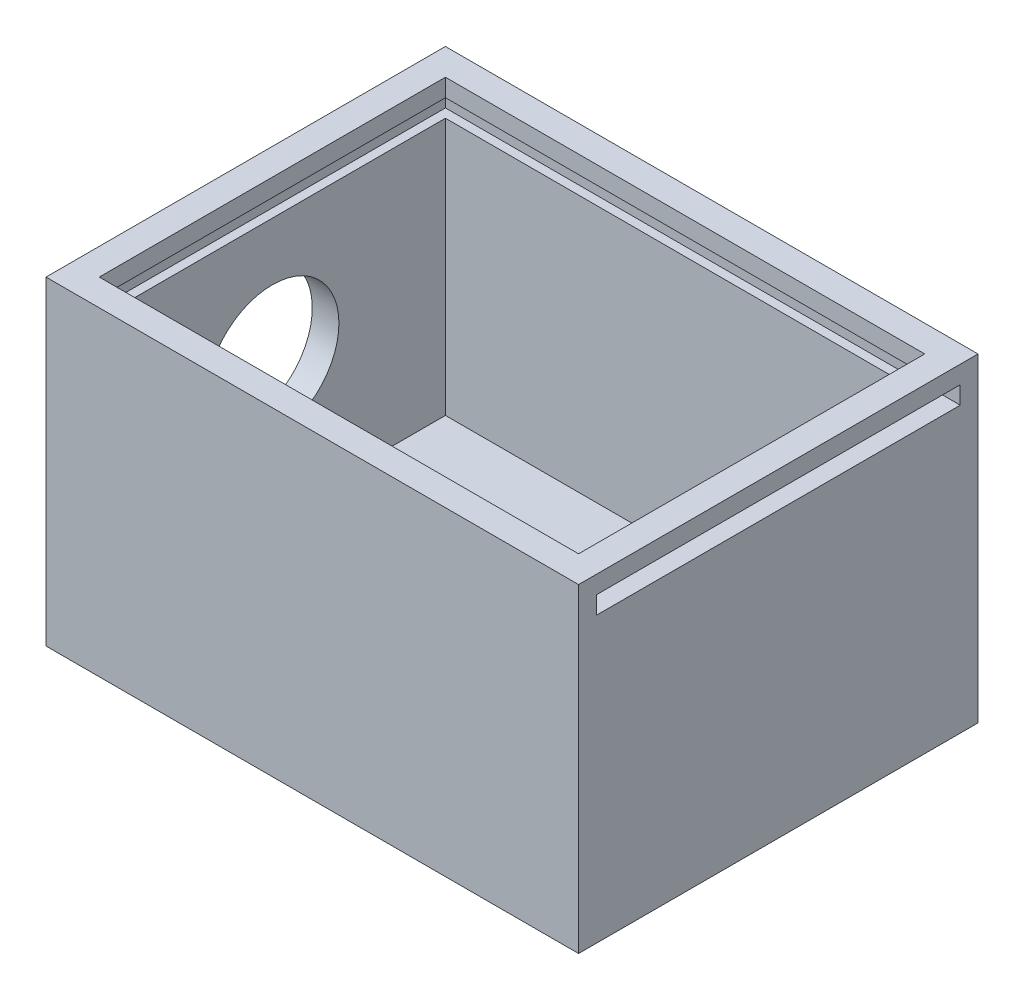
ISO-10303-21;
HEADER;
FILE_DESCRIPTION(('STEP AP214'),'2;1');
FILE_NAME('part.step','',(''),(''),'','','');
FILE_SCHEMA(('AUTOMOTIVE_DESIGN { 1 0 10303 214 1 1 1 1 }'));
ENDSEC;
DATA;
#1=APPLICATION_CONTEXT('core data for automotive mechanical design processes');
#2=APPLICATION_PROTOCOL_DEFINITION('international standard','automotive_design',2000,#1);
#3=PRODUCT_CONTEXT('',#1,'mechanical');
#4=PRODUCT('Part','Part','',(#3));
#5=PRODUCT_RELATED_PRODUCT_CATEGORY('part','',(#4));
#6=PRODUCT_DEFINITION_FORMATION('','',#4);
#7=PRODUCT_DEFINITION_CONTEXT('part definition',#1,'design');
#8=PRODUCT_DEFINITION('design','',#6,#7);
#9=PRODUCT_DEFINITION_SHAPE('','',#8);
#10=(LENGTH_UNIT() NAMED_UNIT(*) SI_UNIT(.MILLI.,.METRE.));
#11=(NAMED_UNIT(*) PLANE_ANGLE_UNIT() SI_UNIT($,.RADIAN.));
#12=(NAMED_UNIT(*) SI_UNIT($,.STERADIAN.) SOLID_ANGLE_UNIT());
#13=UNCERTAINTY_MEASURE_WITH_UNIT(LENGTH_MEASURE(1.E-05),#10,'distance_accuracy_value','');
#14=(GEOMETRIC_REPRESENTATION_CONTEXT(3) GLOBAL_UNCERTAINTY_ASSIGNED_CONTEXT((#13)) GLOBAL_UNIT_ASSIGNED_CONTEXT((#10,
#11,#12)) REPRESENTATION_CONTEXT('',''));
#15=CARTESIAN_POINT('',(0.,0.,0.));
#16=DIRECTION('',(0.,0.,1.));
#17=DIRECTION('',(1.,0.,0.));
#18=AXIS2_PLACEMENT_3D('',#15,#16,#17);
#19=CARTESIAN_POINT('',(3.,0.,45.));
#20=DIRECTION('',(1.,0.,0.));
#21=DIRECTION('',(0.,1.,0.));
#22=AXIS2_PLACEMENT_3D('',#19,#20,#21);
#23=PLANE('',#22);
#24=DIRECTION('',(0.,0.,1.));
#25=VECTOR('',#24,1.);
#26=CARTESIAN_POINT('',(3.,-2.00000000000001,45.));
#27=LINE('',#26,#25);
#28=CARTESIAN_POINT('',(3.,-2.00000000000001,3.));
#29=VERTEX_POINT('',#28);
#30=CARTESIAN_POINT('',(3.,-2.00000000000001,42.));
#31=VERTEX_POINT('',#30);
#32=EDGE_CURVE('E224',#29,#31,#27,.T.);
#33=ORIENTED_EDGE('',*,*,#32,.F.);
#34=DIRECTION('',(0.,-1.,0.));
#35=VECTOR('',#34,1.);
#36=CARTESIAN_POINT('',(3.,0.,3.));
#37=LINE('',#36,#35);
#38=CARTESIAN_POINT('',(3.,0.,3.));
#39=VERTEX_POINT('',#38);
#40=EDGE_CURVE('E232',#39,#29,#37,.T.);
#41=ORIENTED_EDGE('',*,*,#40,.F.);
#42=DIRECTION('',(0.,0.,-1.));
#43=VECTOR('',#42,1.);
#44=CARTESIAN_POINT('',(3.,0.,45.));
#45=LINE('',#44,#43);
#46=CARTESIAN_POINT('',(3.,0.,42.));
#47=VERTEX_POINT('',#46);
#48=EDGE_CURVE('E269',#47,#39,#45,.T.);
#49=ORIENTED_EDGE('',*,*,#48,.F.);
#50=DIRECTION('',(0.,-1.,0.));
#51=VECTOR('',#50,1.);
#52=CARTESIAN_POINT('',(3.,0.,42.));
#53=LINE('',#52,#51);
#54=EDGE_CURVE('E243',#47,#31,#53,.T.);
#55=ORIENTED_EDGE('',*,*,#54,.T.);
#56=EDGE_LOOP('',(#33,#41,#49,#55));
#57=FACE_BOUND('',#56,.T.);
#58=ADVANCED_FACE('F45',(#57),#23,.T.);
#59=CARTESIAN_POINT('',(57.,0.,45.));
#60=DIRECTION('',(-1.,0.,0.));
#61=DIRECTION('',(0.,-1.,0.));
#62=AXIS2_PLACEMENT_3D('',#59,#60,#61);
#63=PLANE('',#62);
#64=DIRECTION('',(0.,0.,-1.));
#65=VECTOR('',#64,1.);
#66=CARTESIAN_POINT('',(57.,-2.,45.));
#67=LINE('',#66,#65);
#68=CARTESIAN_POINT('',(57.,-2.,42.));
#69=VERTEX_POINT('',#68);
#70=CARTESIAN_POINT('',(57.,-2.00000000000001,3.));
#71=VERTEX_POINT('',#70);
#72=EDGE_CURVE('E69',#69,#71,#67,.T.);
#73=ORIENTED_EDGE('',*,*,#72,.F.);
#74=DIRECTION('',(0.,1.,0.));
#75=VECTOR('',#74,1.);
#76=CARTESIAN_POINT('',(57.,0.,42.));
#77=LINE('',#76,#75);
#78=CARTESIAN_POINT('',(57.,0.,42.));
#79=VERTEX_POINT('',#78);
#80=EDGE_CURVE('E258',#69,#79,#77,.T.);
#81=ORIENTED_EDGE('',*,*,#80,.T.);
#82=DIRECTION('',(0.,0.,-1.));
#83=VECTOR('',#82,1.);
#84=CARTESIAN_POINT('',(57.,0.,45.));
#85=LINE('',#84,#83);
#86=CARTESIAN_POINT('',(57.,0.,3.));
#87=VERTEX_POINT('',#86);
#88=EDGE_CURVE('E255',#79,#87,#85,.T.);
#89=ORIENTED_EDGE('',*,*,#88,.T.);
#90=DIRECTION('',(0.,1.,0.));
#91=VECTOR('',#90,1.);
#92=CARTESIAN_POINT('',(57.,0.,3.));
#93=LINE('',#92,#91);
#94=EDGE_CURVE('E251',#71,#87,#93,.T.);
#95=ORIENTED_EDGE('',*,*,#94,.F.);
#96=EDGE_LOOP('',(#73,#81,#89,#95));
#97=FACE_BOUND('',#96,.T.);
#98=ADVANCED_FACE('F351',(#97),#63,.T.);
#99=CARTESIAN_POINT('',(0.,0.,42.));
#100=DIRECTION('',(0.,0.,1.));
#101=DIRECTION('',(1.,0.,0.));
#102=AXIS2_PLACEMENT_3D('',#99,#100,#101);
#103=PLANE('',#102);
#104=ORIENTED_EDGE('',*,*,#80,.F.);
#105=DIRECTION('',(-1.,0.,0.));
#106=VECTOR('',#105,1.);
#107=CARTESIAN_POINT('',(0.,-2.00000000000001,42.));
#108=LINE('',#107,#106);
#109=EDGE_CURVE('E227',#69,#31,#108,.T.);
#110=ORIENTED_EDGE('',*,*,#109,.T.);
#111=ORIENTED_EDGE('',*,*,#54,.F.);
#112=DIRECTION('',(-1.,0.,0.));
#113=VECTOR('',#112,1.);
#114=CARTESIAN_POINT('',(0.,0.,42.));
#115=LINE('',#114,#113);
#116=EDGE_CURVE('E268',#79,#47,#115,.T.);
#117=ORIENTED_EDGE('',*,*,#116,.F.);
#118=EDGE_LOOP('',(#104,#110,#111,#117));
#119=FACE_BOUND('',#118,.T.);
#120=ADVANCED_FACE('F357',(#119),#103,.F.);
#121=CARTESIAN_POINT('',(0.,0.,3.));
#122=DIRECTION('',(0.,0.,1.));
#123=DIRECTION('',(1.,0.,0.));
#124=AXIS2_PLACEMENT_3D('',#121,#122,#123);
#125=PLANE('',#124);
#126=DIRECTION('',(-1.,0.,0.));
#127=VECTOR('',#126,1.);
#128=CARTESIAN_POINT('',(0.,-2.00000000000001,3.));
#129=LINE('',#128,#127);
#130=EDGE_CURVE('E11',#71,#29,#129,.T.);
#131=ORIENTED_EDGE('',*,*,#130,.F.);
#132=ORIENTED_EDGE('',*,*,#94,.T.);
#133=DIRECTION('',(-1.,0.,0.));
#134=VECTOR('',#133,1.);
#135=CARTESIAN_POINT('',(0.,0.,3.));
#136=LINE('',#135,#134);
#137=EDGE_CURVE('E263',#87,#39,#136,.T.);
#138=ORIENTED_EDGE('',*,*,#137,.T.);
#139=ORIENTED_EDGE('',*,*,#40,.T.);
#140=EDGE_LOOP('',(#131,#132,#138,#139));
#141=FACE_BOUND('',#140,.T.);
#142=ADVANCED_FACE('F362',(#141),#125,.T.);
#143=CARTESIAN_POINT('',(0.,0.,45.));
#144=DIRECTION('',(0.,-1.,0.));
#145=DIRECTION('',(0.,0.,-1.));
#146=AXIS2_PLACEMENT_3D('',#143,#144,#145);
#147=PLANE('',#146);
#148=DIRECTION('',(-1.,0.,0.));
#149=VECTOR('',#148,1.);
#150=CARTESIAN_POINT('',(0.,0.,0.));
#151=LINE('',#150,#149);
#152=CARTESIAN_POINT('',(60.,0.,0.));
#153=VERTEX_POINT('',#152);
#154=CARTESIAN_POINT('',(0.,0.,0.));
#155=VERTEX_POINT('',#154);
#156=EDGE_CURVE('E286',#153,#155,#151,.T.);
#157=ORIENTED_EDGE('',*,*,#156,.T.);
#158=DIRECTION('',(0.,0.,-1.));
#159=VECTOR('',#158,1.);
#160=CARTESIAN_POINT('',(0.,0.,45.));
#161=LINE('',#160,#159);
#162=CARTESIAN_POINT('',(0.,0.,45.));
#163=VERTEX_POINT('',#162);
#164=EDGE_CURVE('E295',#163,#155,#161,.T.);
#165=ORIENTED_EDGE('',*,*,#164,.F.);
#166=DIRECTION('',(-1.,0.,0.));
#167=VECTOR('',#166,1.);
#168=CARTESIAN_POINT('',(0.,0.,45.));
#169=LINE('',#168,#167);
#170=CARTESIAN_POINT('',(60.,0.,45.));
#171=VERTEX_POINT('',#170);
#172=EDGE_CURVE('E292',#171,#163,#169,.T.);
#173=ORIENTED_EDGE('',*,*,#172,.F.);
#174=DIRECTION('',(0.,0.,-1.));
#175=VECTOR('',#174,1.);
#176=CARTESIAN_POINT('',(60.,0.,45.));
#177=LINE('',#176,#175);
#178=EDGE_CURVE('E310',#171,#153,#177,.T.);
#179=ORIENTED_EDGE('',*,*,#178,.T.);
#180=EDGE_LOOP('',(#157,#165,#173,#179));
#181=FACE_BOUND('',#180,.T.);
#182=ORIENTED_EDGE('',*,*,#137,.F.);
#183=ORIENTED_EDGE('',*,*,#88,.F.);
#184=ORIENTED_EDGE('',*,*,#116,.T.);
#185=ORIENTED_EDGE('',*,*,#48,.T.);
#186=EDGE_LOOP('',(#182,#183,#184,#185));
#187=FACE_BOUND('',#186,.T.);
#188=ADVANCED_FACE('F359',(#181,#187),#147,.F.);
#189=CARTESIAN_POINT('',(0.,0.,45.));
#190=DIRECTION('',(1.,0.,0.));
#191=DIRECTION('',(0.,1.,0.));
#192=AXIS2_PLACEMENT_3D('',#189,#190,#191);
#193=PLANE('',#192);
#194=CARTESIAN_POINT('',(0.,-18.,22.5));
#195=DIRECTION('',(-1.,0.,0.));
#196=DIRECTION('',(0.,-1.,0.));
#197=AXIS2_PLACEMENT_3D('',#194,#195,#196);
#198=CIRCLE('',#197,7.5);
#199=CARTESIAN_POINT('',(0.,-25.5,22.5));
#200=VERTEX_POINT('',#199);
#201=EDGE_CURVE('E190',#200,#200,#198,.T.);
#202=ORIENTED_EDGE('',*,*,#201,.F.);
#203=EDGE_LOOP('',(#202));
#204=FACE_BOUND('',#203,.T.);
#205=DIRECTION('',(0.,-1.,0.));
#206=VECTOR('',#205,1.);
#207=CARTESIAN_POINT('',(0.,0.,0.));
#208=LINE('',#207,#206);
#209=CARTESIAN_POINT('',(0.,-36.,0.));
#210=VERTEX_POINT('',#209);
#211=EDGE_CURVE('E241',#155,#210,#208,.T.);
#212=ORIENTED_EDGE('',*,*,#211,.T.);
#213=DIRECTION('',(0.,0.,-1.));
#214=VECTOR('',#213,1.);
#215=CARTESIAN_POINT('',(0.,-36.,45.));
#216=LINE('',#215,#214);
#217=CARTESIAN_POINT('',(0.,-36.,45.));
#218=VERTEX_POINT('',#217);
#219=EDGE_CURVE('E318',#218,#210,#216,.T.);
#220=ORIENTED_EDGE('',*,*,#219,.F.);
#221=DIRECTION('',(0.,-1.,0.));
#222=VECTOR('',#221,1.);
#223=CARTESIAN_POINT('',(0.,0.,45.));
#224=LINE('',#223,#222);
#225=EDGE_CURVE('E281',#163,#218,#224,.T.);
#226=ORIENTED_EDGE('',*,*,#225,.F.);
#227=ORIENTED_EDGE('',*,*,#164,.T.);
#228=EDGE_LOOP('',(#212,#220,#226,#227));
#229=FACE_BOUND('',#228,.T.);
#230=ADVANCED_FACE('F47',(#204,#229),#193,.F.);
#231=CARTESIAN_POINT('',(0.,-36.,45.));
#232=DIRECTION('',(0.,1.,0.));
#233=DIRECTION('',(0.,0.,1.));
#234=AXIS2_PLACEMENT_3D('',#231,#232,#233);
#235=PLANE('',#234);
#236=DIRECTION('',(1.,0.,0.));
#237=VECTOR('',#236,1.);
#238=CARTESIAN_POINT('',(0.,-36.,0.));
#239=LINE('',#238,#237);
#240=CARTESIAN_POINT('',(60.,-36.,0.));
#241=VERTEX_POINT('',#240);
#242=EDGE_CURVE('E299',#210,#241,#239,.T.);
#243=ORIENTED_EDGE('',*,*,#242,.T.);
#244=DIRECTION('',(0.,0.,-1.));
#245=VECTOR('',#244,1.);
#246=CARTESIAN_POINT('',(60.,-36.,45.));
#247=LINE('',#246,#245);
#248=CARTESIAN_POINT('',(60.,-36.,45.));
#249=VERTEX_POINT('',#248);
#250=EDGE_CURVE('E314',#249,#241,#247,.T.);
#251=ORIENTED_EDGE('',*,*,#250,.F.);
#252=DIRECTION('',(1.,0.,0.));
#253=VECTOR('',#252,1.);
#254=CARTESIAN_POINT('',(0.,-36.,45.));
#255=LINE('',#254,#253);
#256=EDGE_CURVE('E285',#218,#249,#255,.T.);
#257=ORIENTED_EDGE('',*,*,#256,.F.);
#258=ORIENTED_EDGE('',*,*,#219,.T.);
#259=EDGE_LOOP('',(#243,#251,#257,#258));
#260=FACE_BOUND('',#259,.T.);
#261=ADVANCED_FACE('F409',(#260),#235,.F.);
#262=CARTESIAN_POINT('',(60.,0.,45.));
#263=DIRECTION('',(-1.,0.,0.));
#264=DIRECTION('',(0.,-1.,0.));
#265=AXIS2_PLACEMENT_3D('',#262,#263,#264);
#266=PLANE('',#265);
#267=DIRECTION('',(0.,0.,-1.));
#268=VECTOR('',#267,1.);
#269=CARTESIAN_POINT('',(60.,-3.99999999999999,43.));
#270=LINE('',#269,#268);
#271=CARTESIAN_POINT('',(60.,-3.99999999999999,43.));
#272=VERTEX_POINT('',#271);
#273=CARTESIAN_POINT('',(60.,-3.99999999999999,1.99999999999999));
#274=VERTEX_POINT('',#273);
#275=EDGE_CURVE('E198',#272,#274,#270,.T.);
#276=ORIENTED_EDGE('',*,*,#275,.F.);
#277=DIRECTION('',(0.,-1.,0.));
#278=VECTOR('',#277,1.);
#279=CARTESIAN_POINT('',(60.,-2.,43.));
#280=LINE('',#279,#278);
#281=CARTESIAN_POINT('',(60.,-2.,43.));
#282=VERTEX_POINT('',#281);
#283=EDGE_CURVE('E62',#282,#272,#280,.T.);
#284=ORIENTED_EDGE('',*,*,#283,.F.);
#285=DIRECTION('',(0.,0.,1.));
#286=VECTOR('',#285,1.);
#287=CARTESIAN_POINT('',(60.,-2.,43.));
#288=LINE('',#287,#286);
#289=CARTESIAN_POINT('',(60.,-2.,1.99999999999999));
#290=VERTEX_POINT('',#289);
#291=EDGE_CURVE('E183',#290,#282,#288,.T.);
#292=ORIENTED_EDGE('',*,*,#291,.F.);
#293=DIRECTION('',(0.,1.,0.));
#294=VECTOR('',#293,1.);
#295=CARTESIAN_POINT('',(60.,-2.,1.99999999999999));
#296=LINE('',#295,#294);
#297=EDGE_CURVE('E187',#274,#290,#296,.T.);
#298=ORIENTED_EDGE('',*,*,#297,.F.);
#299=EDGE_LOOP('',(#276,#284,#292,#298));
#300=FACE_BOUND('',#299,.T.);
#301=DIRECTION('',(0.,1.,0.));
#302=VECTOR('',#301,1.);
#303=CARTESIAN_POINT('',(60.,0.,0.));
#304=LINE('',#303,#302);
#305=EDGE_CURVE('E302',#241,#153,#304,.T.);
#306=ORIENTED_EDGE('',*,*,#305,.T.);
#307=ORIENTED_EDGE('',*,*,#178,.F.);
#308=DIRECTION('',(0.,1.,0.));
#309=VECTOR('',#308,1.);
#310=CARTESIAN_POINT('',(60.,0.,45.));
#311=LINE('',#310,#309);
#312=EDGE_CURVE('E289',#249,#171,#311,.T.);
#313=ORIENTED_EDGE('',*,*,#312,.F.);
#314=ORIENTED_EDGE('',*,*,#250,.T.);
#315=EDGE_LOOP('',(#306,#307,#313,#314));
#316=FACE_BOUND('',#315,.T.);
#317=ADVANCED_FACE('F424',(#300,#316),#266,.F.);
#318=CARTESIAN_POINT('',(0.,0.,45.));
#319=DIRECTION('',(0.,0.,1.));
#320=DIRECTION('',(1.,0.,0.));
#321=AXIS2_PLACEMENT_3D('',#318,#319,#320);
#322=PLANE('',#321);
#323=ORIENTED_EDGE('',*,*,#225,.T.);
#324=ORIENTED_EDGE('',*,*,#256,.T.);
#325=ORIENTED_EDGE('',*,*,#312,.T.);
#326=ORIENTED_EDGE('',*,*,#172,.T.);
#327=EDGE_LOOP('',(#323,#324,#325,#326));
#328=FACE_BOUND('',#327,.T.);
#329=ADVANCED_FACE('F376',(#328),#322,.T.);
#330=CARTESIAN_POINT('',(0.,0.,0.));
#331=DIRECTION('',(0.,0.,1.));
#332=DIRECTION('',(1.,0.,0.));
#333=AXIS2_PLACEMENT_3D('',#330,#331,#332);
#334=PLANE('',#333);
#335=ORIENTED_EDGE('',*,*,#211,.F.);
#336=ORIENTED_EDGE('',*,*,#156,.F.);
#337=ORIENTED_EDGE('',*,*,#305,.F.);
#338=ORIENTED_EDGE('',*,*,#242,.F.);
#339=EDGE_LOOP('',(#335,#336,#337,#338));
#340=FACE_BOUND('',#339,.T.);
#341=ADVANCED_FACE('F367',(#340),#334,.F.);
#342=CARTESIAN_POINT('',(1.99999999999999,-2.00000000000001,43.));
#343=DIRECTION('',(0.,1.,0.));
#344=DIRECTION('',(-1.,0.,0.));
#345=AXIS2_PLACEMENT_3D('',#342,#343,#344);
#346=PLANE('',#345);
#347=ORIENTED_EDGE('',*,*,#291,.T.);
#348=DIRECTION('',(1.,0.,0.));
#349=VECTOR('',#348,1.);
#350=CARTESIAN_POINT('',(1.99999999999999,-2.00000000000001,43.));
#351=LINE('',#350,#349);
#352=CARTESIAN_POINT('',(1.99999999999999,-2.00000000000001,43.));
#353=VERTEX_POINT('',#352);
#354=EDGE_CURVE('E204',#353,#282,#351,.T.);
#355=ORIENTED_EDGE('',*,*,#354,.F.);
#356=DIRECTION('',(0.,0.,1.));
#357=VECTOR('',#356,1.);
#358=CARTESIAN_POINT('',(1.99999999999999,-2.00000000000001,43.));
#359=LINE('',#358,#357);
#360=CARTESIAN_POINT('',(1.99999999999999,-2.00000000000001,1.99999999999999));
#361=VERTEX_POINT('',#360);
#362=EDGE_CURVE('E168',#361,#353,#359,.T.);
#363=ORIENTED_EDGE('',*,*,#362,.F.);
#364=DIRECTION('',(1.,0.,0.));
#365=VECTOR('',#364,1.);
#366=CARTESIAN_POINT('',(1.99999999999999,-2.00000000000001,1.99999999999999));
#367=LINE('',#366,#365);
#368=EDGE_CURVE('E208',#361,#290,#367,.T.);
#369=ORIENTED_EDGE('',*,*,#368,.T.);
#370=EDGE_LOOP('',(#347,#355,#363,#369));
#371=FACE_BOUND('',#370,.T.);
#372=ORIENTED_EDGE('',*,*,#72,.T.);
#373=ORIENTED_EDGE('',*,*,#130,.T.);
#374=ORIENTED_EDGE('',*,*,#32,.T.);
#375=ORIENTED_EDGE('',*,*,#109,.F.);
#376=EDGE_LOOP('',(#372,#373,#374,#375));
#377=FACE_BOUND('',#376,.T.);
#378=ADVANCED_FACE('F365',(#371,#377),#346,.F.);
#379=CARTESIAN_POINT('',(1.99999999999999,-4.,43.));
#380=DIRECTION('',(0.,-1.,0.));
#381=DIRECTION('',(1.,0.,0.));
#382=AXIS2_PLACEMENT_3D('',#379,#380,#381);
#383=PLANE('',#382);
#384=ORIENTED_EDGE('',*,*,#275,.T.);
#385=DIRECTION('',(1.,0.,0.));
#386=VECTOR('',#385,1.);
#387=CARTESIAN_POINT('',(1.99999999999999,-4.,1.99999999999999));
#388=LINE('',#387,#386);
#389=CARTESIAN_POINT('',(1.99999999999999,-4.,1.99999999999999));
#390=VERTEX_POINT('',#389);
#391=EDGE_CURVE('E167',#390,#274,#388,.T.);
#392=ORIENTED_EDGE('',*,*,#391,.F.);
#393=DIRECTION('',(0.,0.,-1.));
#394=VECTOR('',#393,1.);
#395=CARTESIAN_POINT('',(1.99999999999999,-4.,43.));
#396=LINE('',#395,#394);
#397=CARTESIAN_POINT('',(1.99999999999999,-4.,43.));
#398=VERTEX_POINT('',#397);
#399=EDGE_CURVE('E171',#398,#390,#396,.T.);
#400=ORIENTED_EDGE('',*,*,#399,.F.);
#401=DIRECTION('',(1.,0.,0.));
#402=VECTOR('',#401,1.);
#403=CARTESIAN_POINT('',(1.99999999999999,-4.,43.));
#404=LINE('',#403,#402);
#405=EDGE_CURVE('E157',#398,#272,#404,.T.);
#406=ORIENTED_EDGE('',*,*,#405,.T.);
#407=EDGE_LOOP('',(#384,#392,#400,#406));
#408=FACE_BOUND('',#407,.T.);
#409=DIRECTION('',(0.,0.,-1.));
#410=VECTOR('',#409,1.);
#411=CARTESIAN_POINT('',(3.,-4.,45.));
#412=LINE('',#411,#410);
#413=CARTESIAN_POINT('',(3.,-4.,42.));
#414=VERTEX_POINT('',#413);
#415=CARTESIAN_POINT('',(3.,-3.99999999999999,3.));
#416=VERTEX_POINT('',#415);
#417=EDGE_CURVE('E215',#414,#416,#412,.T.);
#418=ORIENTED_EDGE('',*,*,#417,.T.);
#419=DIRECTION('',(1.,0.,0.));
#420=VECTOR('',#419,1.);
#421=CARTESIAN_POINT('',(0.,-4.,3.));
#422=LINE('',#421,#420);
#423=CARTESIAN_POINT('',(57.,-3.99999999999999,3.));
#424=VERTEX_POINT('',#423);
#425=EDGE_CURVE('E55',#416,#424,#422,.T.);
#426=ORIENTED_EDGE('',*,*,#425,.T.);
#427=DIRECTION('',(0.,0.,1.));
#428=VECTOR('',#427,1.);
#429=CARTESIAN_POINT('',(57.,-3.99999999999999,45.));
#430=LINE('',#429,#428);
#431=CARTESIAN_POINT('',(57.,-3.99999999999999,42.));
#432=VERTEX_POINT('',#431);
#433=EDGE_CURVE('E207',#424,#432,#430,.T.);
#434=ORIENTED_EDGE('',*,*,#433,.T.);
#435=DIRECTION('',(1.,0.,0.));
#436=VECTOR('',#435,1.);
#437=CARTESIAN_POINT('',(0.,-4.,42.));
#438=LINE('',#437,#436);
#439=EDGE_CURVE('E218',#414,#432,#438,.T.);
#440=ORIENTED_EDGE('',*,*,#439,.F.);
#441=EDGE_LOOP('',(#418,#426,#434,#440));
#442=FACE_BOUND('',#441,.T.);
#443=ADVANCED_FACE('F172',(#408,#442),#383,.F.);
#444=CARTESIAN_POINT('',(1.99999999999999,-2.00000000000001,43.));
#445=DIRECTION('',(0.,0.,1.));
#446=DIRECTION('',(1.,0.,0.));
#447=AXIS2_PLACEMENT_3D('',#444,#445,#446);
#448=PLANE('',#447);
#449=ORIENTED_EDGE('',*,*,#283,.T.);
#450=ORIENTED_EDGE('',*,*,#405,.F.);
#451=DIRECTION('',(0.,-1.,0.));
#452=VECTOR('',#451,1.);
#453=CARTESIAN_POINT('',(1.99999999999999,-2.00000000000001,43.));
#454=LINE('',#453,#452);
#455=EDGE_CURVE('E161',#353,#398,#454,.T.);
#456=ORIENTED_EDGE('',*,*,#455,.F.);
#457=ORIENTED_EDGE('',*,*,#354,.T.);
#458=EDGE_LOOP('',(#449,#450,#456,#457));
#459=FACE_BOUND('',#458,.T.);
#460=ADVANCED_FACE('F159',(#459),#448,.F.);
#461=CARTESIAN_POINT('',(1.99999999999999,-2.00000000000001,1.99999999999999));
#462=DIRECTION('',(0.,0.,-1.));
#463=DIRECTION('',(0.,1.,0.));
#464=AXIS2_PLACEMENT_3D('',#461,#462,#463);
#465=PLANE('',#464);
#466=ORIENTED_EDGE('',*,*,#297,.T.);
#467=ORIENTED_EDGE('',*,*,#368,.F.);
#468=DIRECTION('',(0.,1.,0.));
#469=VECTOR('',#468,1.);
#470=CARTESIAN_POINT('',(1.99999999999999,-2.00000000000001,1.99999999999999));
#471=LINE('',#470,#469);
#472=EDGE_CURVE('E178',#390,#361,#471,.T.);
#473=ORIENTED_EDGE('',*,*,#472,.F.);
#474=ORIENTED_EDGE('',*,*,#391,.T.);
#475=EDGE_LOOP('',(#466,#467,#473,#474));
#476=FACE_BOUND('',#475,.T.);
#477=ADVANCED_FACE('F442',(#476),#465,.F.);
#478=CARTESIAN_POINT('',(1.99999999999999,0.,0.));
#479=DIRECTION('',(1.,0.,0.));
#480=DIRECTION('',(0.,0.,-1.));
#481=AXIS2_PLACEMENT_3D('',#478,#479,#480);
#482=PLANE('',#481);
#483=ORIENTED_EDGE('',*,*,#455,.T.);
#484=ORIENTED_EDGE('',*,*,#399,.T.);
#485=ORIENTED_EDGE('',*,*,#472,.T.);
#486=ORIENTED_EDGE('',*,*,#362,.T.);
#487=EDGE_LOOP('',(#483,#484,#485,#486));
#488=FACE_BOUND('',#487,.T.);
#489=ADVANCED_FACE('F180',(#488),#482,.T.);
#490=CARTESIAN_POINT('',(0.,-33.,45.));
#491=DIRECTION('',(0.,1.,0.));
#492=DIRECTION('',(0.,0.,1.));
#493=AXIS2_PLACEMENT_3D('',#490,#491,#492);
#494=PLANE('',#493);
#495=DIRECTION('',(1.,0.,0.));
#496=VECTOR('',#495,1.);
#497=CARTESIAN_POINT('',(0.,-33.,3.));
#498=LINE('',#497,#496);
#499=CARTESIAN_POINT('',(3.,-33.,3.));
#500=VERTEX_POINT('',#499);
#501=CARTESIAN_POINT('',(57.,-33.,3.));
#502=VERTEX_POINT('',#501);
#503=EDGE_CURVE('E236',#500,#502,#498,.T.);
#504=ORIENTED_EDGE('',*,*,#503,.F.);
#505=DIRECTION('',(0.,0.,-1.));
#506=VECTOR('',#505,1.);
#507=CARTESIAN_POINT('',(3.,-33.,45.));
#508=LINE('',#507,#506);
#509=CARTESIAN_POINT('',(3.,-33.,42.));
#510=VERTEX_POINT('',#509);
#511=EDGE_CURVE('E237',#510,#500,#508,.T.);
#512=ORIENTED_EDGE('',*,*,#511,.F.);
#513=DIRECTION('',(1.,0.,0.));
#514=VECTOR('',#513,1.);
#515=CARTESIAN_POINT('',(0.,-33.,42.));
#516=LINE('',#515,#514);
#517=CARTESIAN_POINT('',(57.,-33.,42.));
#518=VERTEX_POINT('',#517);
#519=EDGE_CURVE('E247',#510,#518,#516,.T.);
#520=ORIENTED_EDGE('',*,*,#519,.T.);
#521=DIRECTION('',(0.,0.,-1.));
#522=VECTOR('',#521,1.);
#523=CARTESIAN_POINT('',(57.,-33.,45.));
#524=LINE('',#523,#522);
#525=EDGE_CURVE('E242',#518,#502,#524,.T.);
#526=ORIENTED_EDGE('',*,*,#525,.T.);
#527=EDGE_LOOP('',(#504,#512,#520,#526));
#528=FACE_BOUND('',#527,.T.);
#529=ADVANCED_FACE('F337',(#528),#494,.T.);
#530=EDGE_CURVE('E248',#414,#510,#53,.T.);
#531=ORIENTED_EDGE('',*,*,#530,.F.);
#532=ORIENTED_EDGE('',*,*,#439,.T.);
#533=EDGE_CURVE('E264',#518,#432,#77,.T.);
#534=ORIENTED_EDGE('',*,*,#533,.F.);
#535=ORIENTED_EDGE('',*,*,#519,.F.);
#536=EDGE_LOOP('',(#531,#532,#534,#535));
#537=FACE_BOUND('',#536,.T.);
#538=ADVANCED_FACE('F341',(#537),#103,.F.);
#539=ORIENTED_EDGE('',*,*,#425,.F.);
#540=EDGE_CURVE('E231',#416,#500,#37,.T.);
#541=ORIENTED_EDGE('',*,*,#540,.T.);
#542=ORIENTED_EDGE('',*,*,#503,.T.);
#543=EDGE_CURVE('E259',#502,#424,#93,.T.);
#544=ORIENTED_EDGE('',*,*,#543,.T.);
#545=EDGE_LOOP('',(#539,#541,#542,#544));
#546=FACE_BOUND('',#545,.T.);
#547=ADVANCED_FACE('F333',(#546),#125,.T.);
#548=ORIENTED_EDGE('',*,*,#433,.F.);
#549=ORIENTED_EDGE('',*,*,#543,.F.);
#550=ORIENTED_EDGE('',*,*,#525,.F.);
#551=ORIENTED_EDGE('',*,*,#533,.T.);
#552=EDGE_LOOP('',(#548,#549,#550,#551));
#553=FACE_BOUND('',#552,.T.);
#554=ADVANCED_FACE('F330',(#553),#63,.T.);
#555=CARTESIAN_POINT('',(3.,-18.,22.5));
#556=DIRECTION('',(1.,0.,0.));
#557=DIRECTION('',(0.,1.,0.));
#558=AXIS2_PLACEMENT_3D('',#555,#556,#557);
#559=CIRCLE('',#558,7.5);
#560=CARTESIAN_POINT('',(3.,-10.5,22.5));
#561=VERTEX_POINT('',#560);
#562=EDGE_CURVE('E49',#561,#561,#559,.T.);
#563=ORIENTED_EDGE('',*,*,#562,.F.);
#564=EDGE_LOOP('',(#563));
#565=FACE_BOUND('',#564,.T.);
#566=ORIENTED_EDGE('',*,*,#417,.F.);
#567=ORIENTED_EDGE('',*,*,#530,.T.);
#568=ORIENTED_EDGE('',*,*,#511,.T.);
#569=ORIENTED_EDGE('',*,*,#540,.F.);
#570=EDGE_LOOP('',(#566,#567,#568,#569));
#571=FACE_BOUND('',#570,.T.);
#572=ADVANCED_FACE('F343',(#565,#571),#23,.T.);
#573=CARTESIAN_POINT('',(48.,-18.,22.5));
#574=DIRECTION('',(-1.,0.,0.));
#575=DIRECTION('',(0.,-1.,0.));
#576=AXIS2_PLACEMENT_3D('',#573,#574,#575);
#577=CYLINDRICAL_SURFACE('',#576,7.5);
#578=ORIENTED_EDGE('',*,*,#562,.T.);
#579=EDGE_LOOP('',(#578));
#580=FACE_BOUND('',#579,.T.);
#581=ORIENTED_EDGE('',*,*,#201,.T.);
#582=EDGE_LOOP('',(#581));
#583=FACE_BOUND('',#582,.T.);
#584=ADVANCED_FACE('F391',(#580,#583),#577,.F.);
#585=CLOSED_SHELL('',(#58,#98,#120,#142,#188,#230,#261,#317,#329,#341,#378,#443,#460,#477,#489,
#529,#538,#547,#554,#572,#584));
#586=MANIFOLD_SOLID_BREP('B2',#585);
#587=ADVANCED_BREP_SHAPE_REPRESENTATION('',(#18,#586),#14);
#588=SHAPE_DEFINITION_REPRESENTATION(#9,#587);
ENDSEC;
END-ISO-10303-21;
